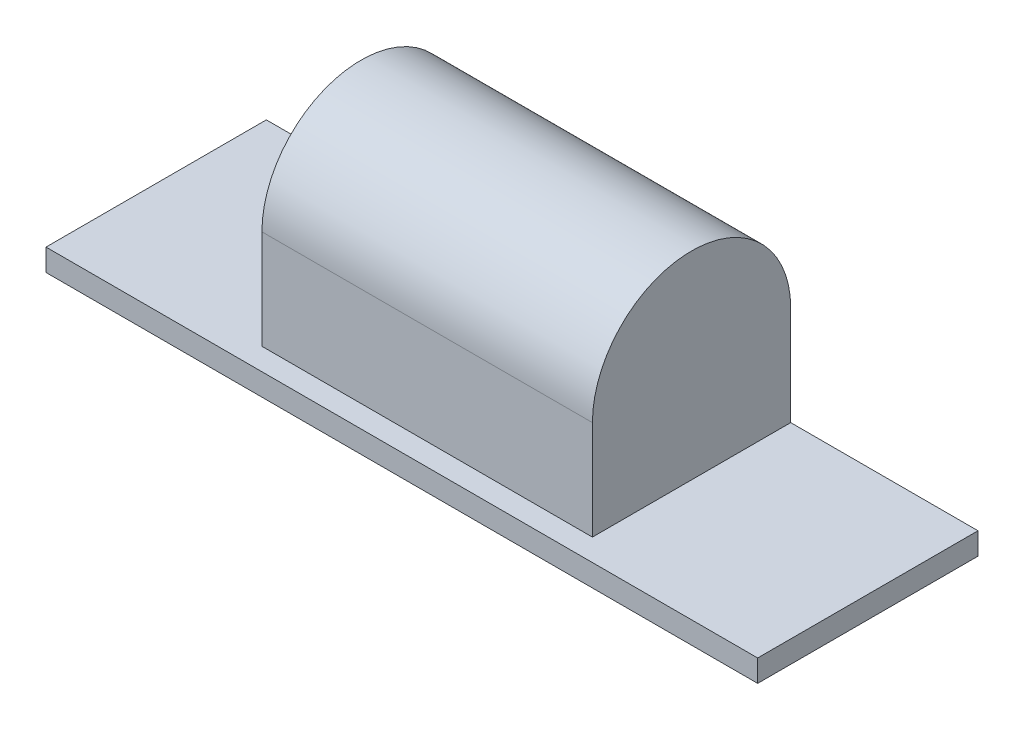
ISO-10303-21;
HEADER;
FILE_DESCRIPTION(('STEP AP214'),'2;1');
FILE_NAME('part.step','',(''),(''),'','','');
FILE_SCHEMA(('AUTOMOTIVE_DESIGN { 1 0 10303 214 1 1 1 1 }'));
ENDSEC;
DATA;
#1=APPLICATION_CONTEXT('core data for automotive mechanical design processes');
#2=APPLICATION_PROTOCOL_DEFINITION('international standard','automotive_design',2000,#1);
#3=PRODUCT_CONTEXT('',#1,'mechanical');
#4=PRODUCT('Part','Part','',(#3));
#5=PRODUCT_RELATED_PRODUCT_CATEGORY('part','',(#4));
#6=PRODUCT_DEFINITION_FORMATION('','',#4);
#7=PRODUCT_DEFINITION_CONTEXT('part definition',#1,'design');
#8=PRODUCT_DEFINITION('design','',#6,#7);
#9=PRODUCT_DEFINITION_SHAPE('','',#8);
#10=(LENGTH_UNIT() NAMED_UNIT(*) SI_UNIT(.MILLI.,.METRE.));
#11=(NAMED_UNIT(*) PLANE_ANGLE_UNIT() SI_UNIT($,.RADIAN.));
#12=(NAMED_UNIT(*) SI_UNIT($,.STERADIAN.) SOLID_ANGLE_UNIT());
#13=UNCERTAINTY_MEASURE_WITH_UNIT(LENGTH_MEASURE(1.E-05),#10,'distance_accuracy_value','');
#14=(GEOMETRIC_REPRESENTATION_CONTEXT(3) GLOBAL_UNCERTAINTY_ASSIGNED_CONTEXT((#13)) GLOBAL_UNIT_ASSIGNED_CONTEXT((#10,
#11,#12)) REPRESENTATION_CONTEXT('',''));
#15=CARTESIAN_POINT('',(0.,0.,0.));
#16=DIRECTION('',(0.,0.,1.));
#17=DIRECTION('',(1.,0.,0.));
#18=AXIS2_PLACEMENT_3D('',#15,#16,#17);
#19=CARTESIAN_POINT('',(15.5855223880597,20.,0.));
#20=DIRECTION('',(1.,0.,0.));
#21=DIRECTION('',(0.,0.,-1.));
#22=AXIS2_PLACEMENT_3D('',#19,#20,#21);
#23=PLANE('',#22);
#24=CARTESIAN_POINT('',(15.5855223880597,11.,-5.5289552238806));
#25=DIRECTION('',(1.,0.,0.));
#26=DIRECTION('',(0.,0.,-1.));
#27=AXIS2_PLACEMENT_3D('',#24,#25,#26);
#28=CIRCLE('',#27,9.);
#29=CARTESIAN_POINT('',(15.5855223880597,11.,-14.5289552238806));
#30=VERTEX_POINT('',#29);
#31=CARTESIAN_POINT('',(15.5855223880597,11.,3.4710447761194));
#32=VERTEX_POINT('',#31);
#33=EDGE_CURVE('E130',#30,#32,#28,.T.);
#34=ORIENTED_EDGE('',*,*,#33,.T.);
#35=DIRECTION('',(0.,-1.,0.));
#36=VECTOR('',#35,1.);
#37=CARTESIAN_POINT('',(15.5855223880597,20.,3.4710447761194));
#38=LINE('',#37,#36);
#39=CARTESIAN_POINT('',(15.5855223880597,2.,3.4710447761194));
#40=VERTEX_POINT('',#39);
#41=EDGE_CURVE('E121',#32,#40,#38,.T.);
#42=ORIENTED_EDGE('',*,*,#41,.T.);
#43=DIRECTION('',(0.,0.,1.));
#44=VECTOR('',#43,1.);
#45=CARTESIAN_POINT('',(15.5855223880597,2.,0.));
#46=LINE('',#45,#44);
#47=CARTESIAN_POINT('',(15.5855223880597,2.,-14.5289552238806));
#48=VERTEX_POINT('',#47);
#49=EDGE_CURVE('E137',#48,#40,#46,.T.);
#50=ORIENTED_EDGE('',*,*,#49,.F.);
#51=DIRECTION('',(0.,-1.,0.));
#52=VECTOR('',#51,1.);
#53=CARTESIAN_POINT('',(15.5855223880597,20.,-14.5289552238806));
#54=LINE('',#53,#52);
#55=EDGE_CURVE('E128',#30,#48,#54,.T.);
#56=ORIENTED_EDGE('',*,*,#55,.F.);
#57=EDGE_LOOP('',(#34,#42,#50,#56));
#58=FACE_BOUND('',#57,.T.);
#59=ADVANCED_FACE('F33',(#58),#23,.T.);
#60=CARTESIAN_POINT('',(-14.4144776119403,20.,0.));
#61=DIRECTION('',(1.,0.,0.));
#62=DIRECTION('',(0.,0.,-1.));
#63=AXIS2_PLACEMENT_3D('',#60,#61,#62);
#64=PLANE('',#63);
#65=DIRECTION('',(0.,-1.,0.));
#66=VECTOR('',#65,1.);
#67=CARTESIAN_POINT('',(-14.4144776119403,20.,3.4710447761194));
#68=LINE('',#67,#66);
#69=CARTESIAN_POINT('',(-14.4144776119403,11.,3.4710447761194));
#70=VERTEX_POINT('',#69);
#71=CARTESIAN_POINT('',(-14.4144776119403,2.,3.4710447761194));
#72=VERTEX_POINT('',#71);
#73=EDGE_CURVE('E119',#70,#72,#68,.T.);
#74=ORIENTED_EDGE('',*,*,#73,.F.);
#75=CARTESIAN_POINT('',(-14.4144776119403,11.,-5.5289552238806));
#76=DIRECTION('',(-1.,0.,0.));
#77=DIRECTION('',(0.,0.,1.));
#78=AXIS2_PLACEMENT_3D('',#75,#76,#77);
#79=CIRCLE('',#78,9.);
#80=CARTESIAN_POINT('',(-14.4144776119403,11.,-14.5289552238806));
#81=VERTEX_POINT('',#80);
#82=EDGE_CURVE('E107',#70,#81,#79,.T.);
#83=ORIENTED_EDGE('',*,*,#82,.T.);
#84=DIRECTION('',(0.,-1.,0.));
#85=VECTOR('',#84,1.);
#86=CARTESIAN_POINT('',(-14.4144776119403,20.,-14.5289552238806));
#87=LINE('',#86,#85);
#88=CARTESIAN_POINT('',(-14.4144776119403,2.,-14.5289552238806));
#89=VERTEX_POINT('',#88);
#90=EDGE_CURVE('E126',#81,#89,#87,.T.);
#91=ORIENTED_EDGE('',*,*,#90,.T.);
#92=DIRECTION('',(0.,0.,1.));
#93=VECTOR('',#92,1.);
#94=CARTESIAN_POINT('',(-14.4144776119403,2.,0.));
#95=LINE('',#94,#93);
#96=EDGE_CURVE('E124',#89,#72,#95,.T.);
#97=ORIENTED_EDGE('',*,*,#96,.T.);
#98=EDGE_LOOP('',(#74,#83,#91,#97));
#99=FACE_BOUND('',#98,.T.);
#100=ADVANCED_FACE('F122',(#99),#64,.F.);
#101=CARTESIAN_POINT('',(0.,2.,-14.5289552238806));
#102=DIRECTION('',(0.,0.,-1.));
#103=DIRECTION('',(-1.,0.,0.));
#104=AXIS2_PLACEMENT_3D('',#101,#102,#103);
#105=PLANE('',#104);
#106=DIRECTION('',(-1.,0.,0.));
#107=VECTOR('',#106,1.);
#108=CARTESIAN_POINT('',(32.5855223880597,11.,-14.5289552238806));
#109=LINE('',#108,#107);
#110=EDGE_CURVE('E111',#30,#81,#109,.T.);
#111=ORIENTED_EDGE('',*,*,#110,.F.);
#112=ORIENTED_EDGE('',*,*,#55,.T.);
#113=DIRECTION('',(1.,0.,0.));
#114=VECTOR('',#113,1.);
#115=CARTESIAN_POINT('',(0.,2.,-14.5289552238806));
#116=LINE('',#115,#114);
#117=CARTESIAN_POINT('',(32.5855223880597,2.,-14.5289552238806));
#118=VERTEX_POINT('',#117);
#119=EDGE_CURVE('E135',#48,#118,#116,.T.);
#120=ORIENTED_EDGE('',*,*,#119,.T.);
#121=DIRECTION('',(0.,-1.,0.));
#122=VECTOR('',#121,1.);
#123=CARTESIAN_POINT('',(32.5855223880597,2.,-14.5289552238806));
#124=LINE('',#123,#122);
#125=CARTESIAN_POINT('',(32.5855223880597,0.,-14.5289552238806));
#126=VERTEX_POINT('',#125);
#127=EDGE_CURVE('E50',#118,#126,#124,.T.);
#128=ORIENTED_EDGE('',*,*,#127,.T.);
#129=DIRECTION('',(1.,0.,0.));
#130=VECTOR('',#129,1.);
#131=CARTESIAN_POINT('',(0.,0.,-14.5289552238806));
#132=LINE('',#131,#130);
#133=CARTESIAN_POINT('',(-32.0144776119403,0.,-14.5289552238806));
#134=VERTEX_POINT('',#133);
#135=EDGE_CURVE('E74',#134,#126,#132,.T.);
#136=ORIENTED_EDGE('',*,*,#135,.F.);
#137=DIRECTION('',(0.,-1.,0.));
#138=VECTOR('',#137,1.);
#139=CARTESIAN_POINT('',(-32.0144776119403,2.,-14.5289552238806));
#140=LINE('',#139,#138);
#141=CARTESIAN_POINT('',(-32.0144776119403,2.,-14.5289552238806));
#142=VERTEX_POINT('',#141);
#143=EDGE_CURVE('E42',#142,#134,#140,.T.);
#144=ORIENTED_EDGE('',*,*,#143,.F.);
#145=EDGE_CURVE('E139',#142,#89,#116,.T.);
#146=ORIENTED_EDGE('',*,*,#145,.T.);
#147=ORIENTED_EDGE('',*,*,#90,.F.);
#148=EDGE_LOOP('',(#111,#112,#120,#128,#136,#144,#146,#147));
#149=FACE_BOUND('',#148,.T.);
#150=ADVANCED_FACE('F35',(#149),#105,.T.);
#151=CARTESIAN_POINT('',(-32.0144776119403,2.,0.));
#152=DIRECTION('',(1.,0.,0.));
#153=DIRECTION('',(0.,0.,-1.));
#154=AXIS2_PLACEMENT_3D('',#151,#152,#153);
#155=PLANE('',#154);
#156=DIRECTION('',(0.,0.,1.));
#157=VECTOR('',#156,1.);
#158=CARTESIAN_POINT('',(-32.0144776119403,0.,0.));
#159=LINE('',#158,#157);
#160=CARTESIAN_POINT('',(-32.0144776119403,0.,5.4710447761194));
#161=VERTEX_POINT('',#160);
#162=EDGE_CURVE('E152',#134,#161,#159,.T.);
#163=ORIENTED_EDGE('',*,*,#162,.T.);
#164=DIRECTION('',(0.,-1.,0.));
#165=VECTOR('',#164,1.);
#166=CARTESIAN_POINT('',(-32.0144776119403,2.,5.4710447761194));
#167=LINE('',#166,#165);
#168=CARTESIAN_POINT('',(-32.0144776119403,2.,5.4710447761194));
#169=VERTEX_POINT('',#168);
#170=EDGE_CURVE('E159',#169,#161,#167,.T.);
#171=ORIENTED_EDGE('',*,*,#170,.F.);
#172=DIRECTION('',(0.,0.,1.));
#173=VECTOR('',#172,1.);
#174=CARTESIAN_POINT('',(-32.0144776119403,2.,0.));
#175=LINE('',#174,#173);
#176=EDGE_CURVE('E145',#142,#169,#175,.T.);
#177=ORIENTED_EDGE('',*,*,#176,.F.);
#178=ORIENTED_EDGE('',*,*,#143,.T.);
#179=EDGE_LOOP('',(#163,#171,#177,#178));
#180=FACE_BOUND('',#179,.T.);
#181=ADVANCED_FACE('F162',(#180),#155,.F.);
#182=CARTESIAN_POINT('',(0.,2.,5.4710447761194));
#183=DIRECTION('',(0.,0.,-1.));
#184=DIRECTION('',(-1.,0.,0.));
#185=AXIS2_PLACEMENT_3D('',#182,#183,#184);
#186=PLANE('',#185);
#187=DIRECTION('',(1.,0.,0.));
#188=VECTOR('',#187,1.);
#189=CARTESIAN_POINT('',(0.,0.,5.4710447761194));
#190=LINE('',#189,#188);
#191=CARTESIAN_POINT('',(32.5855223880597,0.,5.4710447761194));
#192=VERTEX_POINT('',#191);
#193=EDGE_CURVE('E154',#161,#192,#190,.T.);
#194=ORIENTED_EDGE('',*,*,#193,.T.);
#195=DIRECTION('',(0.,-1.,0.));
#196=VECTOR('',#195,1.);
#197=CARTESIAN_POINT('',(32.5855223880597,2.,5.4710447761194));
#198=LINE('',#197,#196);
#199=CARTESIAN_POINT('',(32.5855223880597,2.,5.4710447761194));
#200=VERTEX_POINT('',#199);
#201=EDGE_CURVE('E66',#200,#192,#198,.T.);
#202=ORIENTED_EDGE('',*,*,#201,.F.);
#203=DIRECTION('',(1.,0.,0.));
#204=VECTOR('',#203,1.);
#205=CARTESIAN_POINT('',(0.,2.,5.4710447761194));
#206=LINE('',#205,#204);
#207=EDGE_CURVE('E147',#169,#200,#206,.T.);
#208=ORIENTED_EDGE('',*,*,#207,.F.);
#209=ORIENTED_EDGE('',*,*,#170,.T.);
#210=EDGE_LOOP('',(#194,#202,#208,#209));
#211=FACE_BOUND('',#210,.T.);
#212=ADVANCED_FACE('F172',(#211),#186,.F.);
#213=CARTESIAN_POINT('',(32.5855223880597,2.,0.));
#214=DIRECTION('',(1.,0.,0.));
#215=DIRECTION('',(0.,0.,-1.));
#216=AXIS2_PLACEMENT_3D('',#213,#214,#215);
#217=PLANE('',#216);
#218=DIRECTION('',(0.,0.,1.));
#219=VECTOR('',#218,1.);
#220=CARTESIAN_POINT('',(32.5855223880597,0.,0.));
#221=LINE('',#220,#219);
#222=EDGE_CURVE('E138',#126,#192,#221,.T.);
#223=ORIENTED_EDGE('',*,*,#222,.F.);
#224=ORIENTED_EDGE('',*,*,#127,.F.);
#225=DIRECTION('',(0.,0.,1.));
#226=VECTOR('',#225,1.);
#227=CARTESIAN_POINT('',(32.5855223880597,2.,0.));
#228=LINE('',#227,#226);
#229=EDGE_CURVE('E149',#118,#200,#228,.T.);
#230=ORIENTED_EDGE('',*,*,#229,.T.);
#231=ORIENTED_EDGE('',*,*,#201,.T.);
#232=EDGE_LOOP('',(#223,#224,#230,#231));
#233=FACE_BOUND('',#232,.T.);
#234=ADVANCED_FACE('F169',(#233),#217,.T.);
#235=CARTESIAN_POINT('',(0.,2.,0.));
#236=DIRECTION('',(0.,1.,0.));
#237=DIRECTION('',(0.,0.,1.));
#238=AXIS2_PLACEMENT_3D('',#235,#236,#237);
#239=PLANE('',#238);
#240=ORIENTED_EDGE('',*,*,#119,.F.);
#241=ORIENTED_EDGE('',*,*,#49,.T.);
#242=DIRECTION('',(1.,0.,0.));
#243=VECTOR('',#242,1.);
#244=CARTESIAN_POINT('',(0.,2.,3.4710447761194));
#245=LINE('',#244,#243);
#246=EDGE_CURVE('E142',#72,#40,#245,.T.);
#247=ORIENTED_EDGE('',*,*,#246,.F.);
#248=ORIENTED_EDGE('',*,*,#96,.F.);
#249=ORIENTED_EDGE('',*,*,#145,.F.);
#250=ORIENTED_EDGE('',*,*,#176,.T.);
#251=ORIENTED_EDGE('',*,*,#207,.T.);
#252=ORIENTED_EDGE('',*,*,#229,.F.);
#253=EDGE_LOOP('',(#240,#241,#247,#248,#249,#250,#251,#252));
#254=FACE_BOUND('',#253,.T.);
#255=ADVANCED_FACE('F171',(#254),#239,.T.);
#256=CARTESIAN_POINT('',(0.,0.,0.));
#257=DIRECTION('',(0.,1.,0.));
#258=DIRECTION('',(0.,0.,1.));
#259=AXIS2_PLACEMENT_3D('',#256,#257,#258);
#260=PLANE('',#259);
#261=ORIENTED_EDGE('',*,*,#135,.T.);
#262=ORIENTED_EDGE('',*,*,#222,.T.);
#263=ORIENTED_EDGE('',*,*,#193,.F.);
#264=ORIENTED_EDGE('',*,*,#162,.F.);
#265=EDGE_LOOP('',(#261,#262,#263,#264));
#266=FACE_BOUND('',#265,.T.);
#267=ADVANCED_FACE('F166',(#266),#260,.F.);
#268=CARTESIAN_POINT('',(0.,20.,3.4710447761194));
#269=DIRECTION('',(0.,0.,-1.));
#270=DIRECTION('',(-1.,0.,0.));
#271=AXIS2_PLACEMENT_3D('',#268,#269,#270);
#272=PLANE('',#271);
#273=ORIENTED_EDGE('',*,*,#41,.F.);
#274=DIRECTION('',(-1.,0.,0.));
#275=VECTOR('',#274,1.);
#276=CARTESIAN_POINT('',(32.5855223880597,11.,3.4710447761194));
#277=LINE('',#276,#275);
#278=EDGE_CURVE('E11',#32,#70,#277,.T.);
#279=ORIENTED_EDGE('',*,*,#278,.T.);
#280=ORIENTED_EDGE('',*,*,#73,.T.);
#281=ORIENTED_EDGE('',*,*,#246,.T.);
#282=EDGE_LOOP('',(#273,#279,#280,#281));
#283=FACE_BOUND('',#282,.T.);
#284=ADVANCED_FACE('F117',(#283),#272,.F.);
#285=CARTESIAN_POINT('',(32.5855223880597,11.,-5.5289552238806));
#286=DIRECTION('',(-1.,0.,0.));
#287=DIRECTION('',(0.,0.,1.));
#288=AXIS2_PLACEMENT_3D('',#285,#286,#287);
#289=CYLINDRICAL_SURFACE('',#288,9.);
#290=ORIENTED_EDGE('',*,*,#110,.T.);
#291=ORIENTED_EDGE('',*,*,#82,.F.);
#292=ORIENTED_EDGE('',*,*,#278,.F.);
#293=ORIENTED_EDGE('',*,*,#33,.F.);
#294=EDGE_LOOP('',(#290,#291,#292,#293));
#295=FACE_BOUND('',#294,.T.);
#296=ADVANCED_FACE('F108',(#295),#289,.T.);
#297=CLOSED_SHELL('',(#59,#100,#150,#181,#212,#234,#255,#267,#284,#296));
#298=MANIFOLD_SOLID_BREP('B2',#297);
#299=ADVANCED_BREP_SHAPE_REPRESENTATION('',(#18,#298),#14);
#300=SHAPE_DEFINITION_REPRESENTATION(#9,#299);
ENDSEC;
END-ISO-10303-21;
